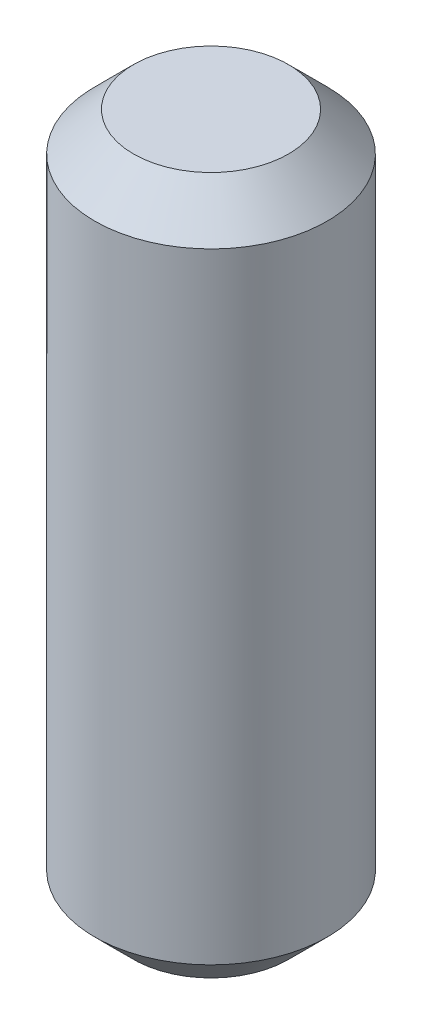
ISO-10303-21;
HEADER;
FILE_DESCRIPTION(('STEP AP214'),'2;1');
FILE_NAME('part.step','',(''),(''),'','','');
FILE_SCHEMA(('AUTOMOTIVE_DESIGN { 1 0 10303 214 1 1 1 1 }'));
ENDSEC;
DATA;
#1=APPLICATION_CONTEXT('core data for automotive mechanical design processes');
#2=APPLICATION_PROTOCOL_DEFINITION('international standard','automotive_design',2000,#1);
#3=PRODUCT_CONTEXT('',#1,'mechanical');
#4=PRODUCT('Part','Part','',(#3));
#5=PRODUCT_RELATED_PRODUCT_CATEGORY('part','',(#4));
#6=PRODUCT_DEFINITION_FORMATION('','',#4);
#7=PRODUCT_DEFINITION_CONTEXT('part definition',#1,'design');
#8=PRODUCT_DEFINITION('design','',#6,#7);
#9=PRODUCT_DEFINITION_SHAPE('','',#8);
#10=(LENGTH_UNIT() NAMED_UNIT(*) SI_UNIT(.MILLI.,.METRE.));
#11=(NAMED_UNIT(*) PLANE_ANGLE_UNIT() SI_UNIT($,.RADIAN.));
#12=(NAMED_UNIT(*) SI_UNIT($,.STERADIAN.) SOLID_ANGLE_UNIT());
#13=UNCERTAINTY_MEASURE_WITH_UNIT(LENGTH_MEASURE(1.E-05),#10,'distance_accuracy_value','');
#14=(GEOMETRIC_REPRESENTATION_CONTEXT(3) GLOBAL_UNCERTAINTY_ASSIGNED_CONTEXT((#13)) GLOBAL_UNIT_ASSIGNED_CONTEXT((#10,
#11,#12)) REPRESENTATION_CONTEXT('',''));
#15=CARTESIAN_POINT('',(0.,0.,0.));
#16=DIRECTION('',(0.,0.,1.));
#17=DIRECTION('',(1.,0.,0.));
#18=AXIS2_PLACEMENT_3D('',#15,#16,#17);
#19=CARTESIAN_POINT('',(0.,9.,0.));
#20=DIRECTION('',(0.,1.,0.));
#21=DIRECTION('',(0.,0.,1.));
#22=AXIS2_PLACEMENT_3D('',#19,#20,#21);
#23=PLANE('',#22);
#24=CARTESIAN_POINT('',(0.,9.,0.));
#25=DIRECTION('',(0.,1.,0.));
#26=DIRECTION('',(0.,0.,1.));
#27=AXIS2_PLACEMENT_3D('',#24,#25,#26);
#28=CIRCLE('',#27,0.999999999999997);
#29=CARTESIAN_POINT('',(0.,9.,0.999999999999997));
#30=VERTEX_POINT('',#29);
#31=EDGE_CURVE('E10',#30,#30,#28,.T.);
#32=ORIENTED_EDGE('',*,*,#31,.T.);
#33=EDGE_LOOP('',(#32));
#34=FACE_BOUND('',#33,.T.);
#35=ADVANCED_FACE('F43',(#34),#23,.T.);
#36=CARTESIAN_POINT('',(0.,0.,0.));
#37=DIRECTION('',(0.,-1.,0.));
#38=DIRECTION('',(0.,0.,-1.));
#39=AXIS2_PLACEMENT_3D('',#36,#37,#38);
#40=CYLINDRICAL_SURFACE('',#39,1.5);
#41=CARTESIAN_POINT('',(0.,0.500000000000001,0.));
#42=DIRECTION('',(0.,-1.,0.));
#43=DIRECTION('',(0.,0.,-1.));
#44=AXIS2_PLACEMENT_3D('',#41,#42,#43);
#45=CIRCLE('',#44,1.5);
#46=CARTESIAN_POINT('',(0.,0.500000000000001,-1.5));
#47=VERTEX_POINT('',#46);
#48=EDGE_CURVE('E52',#47,#47,#45,.F.);
#49=ORIENTED_EDGE('',*,*,#48,.T.);
#50=EDGE_LOOP('',(#49));
#51=FACE_BOUND('',#50,.T.);
#52=CARTESIAN_POINT('',(0.,8.5,0.));
#53=DIRECTION('',(0.,1.,0.));
#54=DIRECTION('',(0.,0.,1.));
#55=AXIS2_PLACEMENT_3D('',#52,#53,#54);
#56=CIRCLE('',#55,1.5);
#57=CARTESIAN_POINT('',(0.,8.5,1.5));
#58=VERTEX_POINT('',#57);
#59=EDGE_CURVE('E57',#58,#58,#56,.F.);
#60=ORIENTED_EDGE('',*,*,#59,.T.);
#61=EDGE_LOOP('',(#60));
#62=FACE_BOUND('',#61,.T.);
#63=ADVANCED_FACE('F79',(#51,#62),#40,.T.);
#64=CARTESIAN_POINT('',(1.5,0.,0.));
#65=DIRECTION('',(0.,-1.,0.));
#66=DIRECTION('',(0.,0.,-1.));
#67=AXIS2_PLACEMENT_3D('',#64,#65,#66);
#68=PLANE('',#67);
#69=CARTESIAN_POINT('',(0.,0.,0.));
#70=DIRECTION('',(0.,-1.,0.));
#71=DIRECTION('',(0.,0.,-1.));
#72=AXIS2_PLACEMENT_3D('',#69,#70,#71);
#73=CIRCLE('',#72,1.);
#74=CARTESIAN_POINT('',(0.,0.,-1.));
#75=VERTEX_POINT('',#74);
#76=EDGE_CURVE('E62',#75,#75,#73,.T.);
#77=ORIENTED_EDGE('',*,*,#76,.T.);
#78=EDGE_LOOP('',(#77));
#79=FACE_BOUND('',#78,.T.);
#80=ADVANCED_FACE('F69',(#79),#68,.T.);
#81=CARTESIAN_POINT('',(0.,0.,0.));
#82=DIRECTION('',(0.,1.,0.));
#83=DIRECTION('',(0.,0.,1.));
#84=AXIS2_PLACEMENT_3D('',#81,#82,#83);
#85=CONICAL_SURFACE('',#84,1.,0.785398163397447);
#86=ORIENTED_EDGE('',*,*,#48,.F.);
#87=EDGE_LOOP('',(#86));
#88=FACE_BOUND('',#87,.T.);
#89=ORIENTED_EDGE('',*,*,#76,.F.);
#90=EDGE_LOOP('',(#89));
#91=FACE_BOUND('',#90,.T.);
#92=ADVANCED_FACE('F71',(#88,#91),#85,.T.);
#93=CARTESIAN_POINT('',(0.,8.5,0.));
#94=DIRECTION('',(0.,-1.,0.));
#95=DIRECTION('',(0.,0.,-1.));
#96=AXIS2_PLACEMENT_3D('',#93,#94,#95);
#97=CONICAL_SURFACE('',#96,1.5,0.78539816339745);
#98=ORIENTED_EDGE('',*,*,#31,.F.);
#99=EDGE_LOOP('',(#98));
#100=FACE_BOUND('',#99,.T.);
#101=ORIENTED_EDGE('',*,*,#59,.F.);
#102=EDGE_LOOP('',(#101));
#103=FACE_BOUND('',#102,.T.);
#104=ADVANCED_FACE('F46',(#100,#103),#97,.T.);
#105=CLOSED_SHELL('',(#35,#63,#80,#92,#104));
#106=MANIFOLD_SOLID_BREP('B2',#105);
#107=ADVANCED_BREP_SHAPE_REPRESENTATION('',(#18,#106),#14);
#108=SHAPE_DEFINITION_REPRESENTATION(#9,#107);
ENDSEC;
END-ISO-10303-21;
